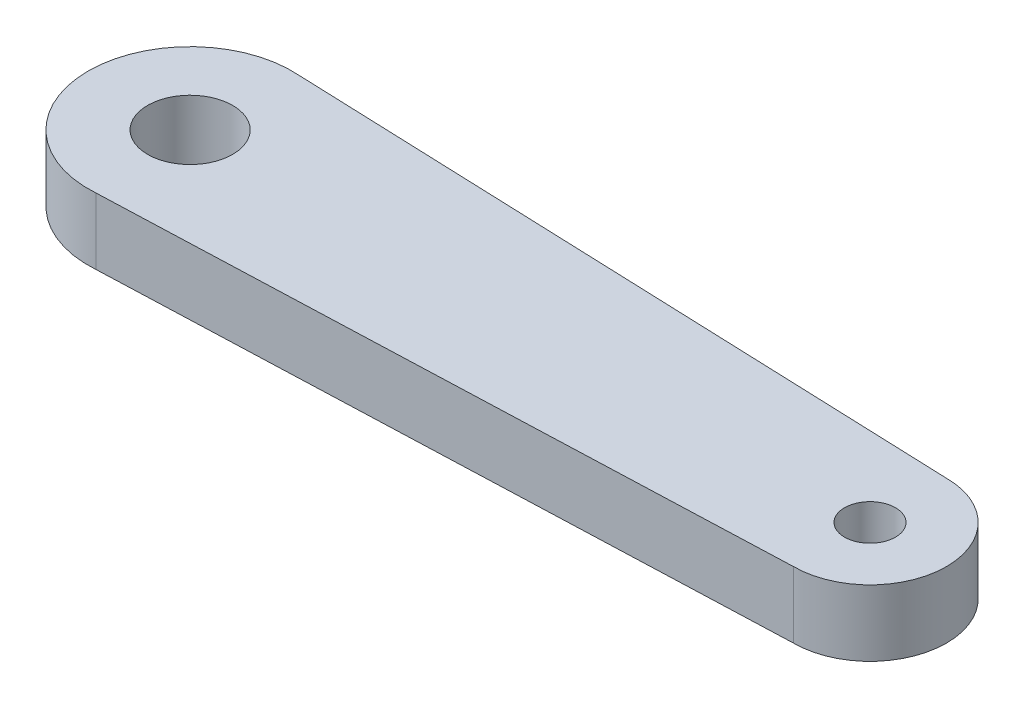
ISO-10303-21;
HEADER;
FILE_DESCRIPTION(('STEP AP214'),'2;1');
FILE_NAME('part.step','',(''),(''),'','','');
FILE_SCHEMA(('AUTOMOTIVE_DESIGN { 1 0 10303 214 1 1 1 1 }'));
ENDSEC;
DATA;
#1=APPLICATION_CONTEXT('core data for automotive mechanical design processes');
#2=APPLICATION_PROTOCOL_DEFINITION('international standard','automotive_design',2000,#1);
#3=PRODUCT_CONTEXT('',#1,'mechanical');
#4=PRODUCT('Part','Part','',(#3));
#5=PRODUCT_RELATED_PRODUCT_CATEGORY('part','',(#4));
#6=PRODUCT_DEFINITION_FORMATION('','',#4);
#7=PRODUCT_DEFINITION_CONTEXT('part definition',#1,'design');
#8=PRODUCT_DEFINITION('design','',#6,#7);
#9=PRODUCT_DEFINITION_SHAPE('','',#8);
#10=(LENGTH_UNIT() NAMED_UNIT(*) SI_UNIT(.MILLI.,.METRE.));
#11=(NAMED_UNIT(*) PLANE_ANGLE_UNIT() SI_UNIT($,.RADIAN.));
#12=(NAMED_UNIT(*) SI_UNIT($,.STERADIAN.) SOLID_ANGLE_UNIT());
#13=UNCERTAINTY_MEASURE_WITH_UNIT(LENGTH_MEASURE(1.E-05),#10,'distance_accuracy_value','');
#14=(GEOMETRIC_REPRESENTATION_CONTEXT(3) GLOBAL_UNCERTAINTY_ASSIGNED_CONTEXT((#13)) GLOBAL_UNIT_ASSIGNED_CONTEXT((#10,
#11,#12)) REPRESENTATION_CONTEXT('',''));
#15=CARTESIAN_POINT('',(0.,0.,0.));
#16=DIRECTION('',(0.,0.,1.));
#17=DIRECTION('',(1.,0.,0.));
#18=AXIS2_PLACEMENT_3D('',#15,#16,#17);
#19=CARTESIAN_POINT('',(0.,3.9,0.));
#20=DIRECTION('',(0.,-1.,0.));
#21=DIRECTION('',(0.,0.,-1.));
#22=AXIS2_PLACEMENT_3D('',#19,#20,#21);
#23=CYLINDRICAL_SURFACE('',#22,6.);
#24=CARTESIAN_POINT('',(0.,0.,0.));
#25=DIRECTION('',(0.,1.,0.));
#26=DIRECTION('',(0.,0.,1.));
#27=AXIS2_PLACEMENT_3D('',#24,#25,#26);
#28=CIRCLE('',#27,6.);
#29=CARTESIAN_POINT('',(0.449368076142934,0.,-5.98314869714464));
#30=VERTEX_POINT('',#29);
#31=CARTESIAN_POINT('',(0.449368076142934,0.,5.98314869714464));
#32=VERTEX_POINT('',#31);
#33=EDGE_CURVE('E110',#30,#32,#28,.T.);
#34=ORIENTED_EDGE('',*,*,#33,.T.);
#35=DIRECTION('',(0.,-1.,0.));
#36=VECTOR('',#35,1.);
#37=CARTESIAN_POINT('',(0.449368076142934,3.9,5.98314869714464));
#38=LINE('',#37,#36);
#39=CARTESIAN_POINT('',(0.449368076142934,3.9,5.98314869714464));
#40=VERTEX_POINT('',#39);
#41=EDGE_CURVE('E11',#40,#32,#38,.T.);
#42=ORIENTED_EDGE('',*,*,#41,.F.);
#43=CARTESIAN_POINT('',(0.,3.9,0.));
#44=DIRECTION('',(0.,1.,0.));
#45=DIRECTION('',(0.,0.,1.));
#46=AXIS2_PLACEMENT_3D('',#43,#44,#45);
#47=CIRCLE('',#46,6.);
#48=CARTESIAN_POINT('',(0.449368076142934,3.9,-5.98314869714464));
#49=VERTEX_POINT('',#48);
#50=EDGE_CURVE('E91',#49,#40,#47,.T.);
#51=ORIENTED_EDGE('',*,*,#50,.F.);
#52=DIRECTION('',(0.,-1.,0.));
#53=VECTOR('',#52,1.);
#54=CARTESIAN_POINT('',(0.449368076142934,3.9,-5.98314869714464));
#55=LINE('',#54,#53);
#56=EDGE_CURVE('E58',#49,#30,#55,.T.);
#57=ORIENTED_EDGE('',*,*,#56,.T.);
#58=EDGE_LOOP('',(#34,#42,#51,#57));
#59=FACE_BOUND('',#58,.T.);
#60=ADVANCED_FACE('F39',(#59),#23,.T.);
#61=CARTESIAN_POINT('',(0.449368076142934,3.9,5.98314869714464));
#62=DIRECTION('',(-0.0374736605890943,0.,-0.999297615709181));
#63=DIRECTION('',(-0.999297615709181,0.,0.0374736605890943));
#64=AXIS2_PLACEMENT_3D('',#61,#62,#63);
#65=PLANE('',#64);
#66=DIRECTION('',(0.999297615709181,0.,-0.0374736605890943));
#67=VECTOR('',#66,1.);
#68=CARTESIAN_POINT('',(0.449368076142934,0.,5.98314869714464));
#69=LINE('',#68,#67);
#70=CARTESIAN_POINT('',(40.,0.,4.5));
#71=VERTEX_POINT('',#70);
#72=EDGE_CURVE('E97',#32,#71,#69,.T.);
#73=ORIENTED_EDGE('',*,*,#72,.T.);
#74=DIRECTION('',(0.,-1.,0.));
#75=VECTOR('',#74,1.);
#76=CARTESIAN_POINT('',(40.,3.9,4.5));
#77=LINE('',#76,#75);
#78=CARTESIAN_POINT('',(40.,3.9,4.5));
#79=VERTEX_POINT('',#78);
#80=EDGE_CURVE('E49',#79,#71,#77,.T.);
#81=ORIENTED_EDGE('',*,*,#80,.F.);
#82=DIRECTION('',(0.999297615709181,0.,-0.0374736605890943));
#83=VECTOR('',#82,1.);
#84=CARTESIAN_POINT('',(0.449368076142934,3.9,5.98314869714464));
#85=LINE('',#84,#83);
#86=EDGE_CURVE('E84',#40,#79,#85,.T.);
#87=ORIENTED_EDGE('',*,*,#86,.F.);
#88=ORIENTED_EDGE('',*,*,#41,.T.);
#89=EDGE_LOOP('',(#73,#81,#87,#88));
#90=FACE_BOUND('',#89,.T.);
#91=ADVANCED_FACE('F96',(#90),#65,.F.);
#92=CARTESIAN_POINT('',(40.,3.9,0.));
#93=DIRECTION('',(0.,-1.,0.));
#94=DIRECTION('',(0.,0.,-1.));
#95=AXIS2_PLACEMENT_3D('',#92,#93,#94);
#96=CYLINDRICAL_SURFACE('',#95,4.5);
#97=CARTESIAN_POINT('',(40.,0.,0.));
#98=DIRECTION('',(0.,1.,0.));
#99=DIRECTION('',(0.,0.,1.));
#100=AXIS2_PLACEMENT_3D('',#97,#98,#99);
#101=CIRCLE('',#100,4.5);
#102=CARTESIAN_POINT('',(40.,0.,-4.5));
#103=VERTEX_POINT('',#102);
#104=EDGE_CURVE('E116',#71,#103,#101,.T.);
#105=ORIENTED_EDGE('',*,*,#104,.T.);
#106=DIRECTION('',(0.,-1.,0.));
#107=VECTOR('',#106,1.);
#108=CARTESIAN_POINT('',(40.,3.9,-4.5));
#109=LINE('',#108,#107);
#110=CARTESIAN_POINT('',(40.,3.9,-4.5));
#111=VERTEX_POINT('',#110);
#112=EDGE_CURVE('E73',#111,#103,#109,.T.);
#113=ORIENTED_EDGE('',*,*,#112,.F.);
#114=CARTESIAN_POINT('',(40.,3.9,0.));
#115=DIRECTION('',(0.,1.,0.));
#116=DIRECTION('',(0.,0.,1.));
#117=AXIS2_PLACEMENT_3D('',#114,#115,#116);
#118=CIRCLE('',#117,4.5);
#119=EDGE_CURVE('E90',#79,#111,#118,.T.);
#120=ORIENTED_EDGE('',*,*,#119,.F.);
#121=ORIENTED_EDGE('',*,*,#80,.T.);
#122=EDGE_LOOP('',(#105,#113,#120,#121));
#123=FACE_BOUND('',#122,.T.);
#124=ADVANCED_FACE('F102',(#123),#96,.T.);
#125=CARTESIAN_POINT('',(0.449368076142934,3.9,-5.98314869714464));
#126=DIRECTION('',(0.0374736605890943,0.,-0.999297615709181));
#127=DIRECTION('',(-0.999297615709181,0.,-0.0374736605890943));
#128=AXIS2_PLACEMENT_3D('',#125,#126,#127);
#129=PLANE('',#128);
#130=DIRECTION('',(0.999297615709181,0.,0.0374736605890943));
#131=VECTOR('',#130,1.);
#132=CARTESIAN_POINT('',(0.449368076142934,0.,-5.98314869714464));
#133=LINE('',#132,#131);
#134=EDGE_CURVE('E119',#30,#103,#133,.T.);
#135=ORIENTED_EDGE('',*,*,#134,.F.);
#136=ORIENTED_EDGE('',*,*,#56,.F.);
#137=DIRECTION('',(0.999297615709181,0.,0.0374736605890943));
#138=VECTOR('',#137,1.);
#139=CARTESIAN_POINT('',(0.449368076142934,3.9,-5.98314869714464));
#140=LINE('',#139,#138);
#141=EDGE_CURVE('E104',#49,#111,#140,.T.);
#142=ORIENTED_EDGE('',*,*,#141,.T.);
#143=ORIENTED_EDGE('',*,*,#112,.T.);
#144=EDGE_LOOP('',(#135,#136,#142,#143));
#145=FACE_BOUND('',#144,.T.);
#146=ADVANCED_FACE('F158',(#145),#129,.T.);
#147=CARTESIAN_POINT('',(0.,3.9,0.));
#148=DIRECTION('',(0.,1.,0.));
#149=DIRECTION('',(0.,0.,1.));
#150=AXIS2_PLACEMENT_3D('',#147,#148,#149);
#151=PLANE('',#150);
#152=CARTESIAN_POINT('',(0.,3.9,0.));
#153=DIRECTION('',(0.,1.,0.));
#154=DIRECTION('',(0.,0.,1.));
#155=AXIS2_PLACEMENT_3D('',#152,#153,#154);
#156=CIRCLE('',#155,2.5);
#157=CARTESIAN_POINT('',(0.,3.9,2.5));
#158=VERTEX_POINT('',#157);
#159=EDGE_CURVE('E113',#158,#158,#156,.F.);
#160=ORIENTED_EDGE('',*,*,#159,.T.);
#161=EDGE_LOOP('',(#160));
#162=FACE_BOUND('',#161,.T.);
#163=CARTESIAN_POINT('',(40.,3.9,0.));
#164=DIRECTION('',(0.,1.,0.));
#165=DIRECTION('',(0.,0.,1.));
#166=AXIS2_PLACEMENT_3D('',#163,#164,#165);
#167=CIRCLE('',#166,1.5);
#168=CARTESIAN_POINT('',(40.,3.9,1.5));
#169=VERTEX_POINT('',#168);
#170=EDGE_CURVE('E129',#169,#169,#167,.F.);
#171=ORIENTED_EDGE('',*,*,#170,.T.);
#172=EDGE_LOOP('',(#171));
#173=FACE_BOUND('',#172,.T.);
#174=ORIENTED_EDGE('',*,*,#50,.T.);
#175=ORIENTED_EDGE('',*,*,#86,.T.);
#176=ORIENTED_EDGE('',*,*,#119,.T.);
#177=ORIENTED_EDGE('',*,*,#141,.F.);
#178=EDGE_LOOP('',(#174,#175,#176,#177));
#179=FACE_BOUND('',#178,.T.);
#180=ADVANCED_FACE('F87',(#162,#173,#179),#151,.T.);
#181=CARTESIAN_POINT('',(0.,0.,0.));
#182=DIRECTION('',(0.,1.,0.));
#183=DIRECTION('',(0.,0.,1.));
#184=AXIS2_PLACEMENT_3D('',#181,#182,#183);
#185=PLANE('',#184);
#186=CARTESIAN_POINT('',(0.,0.,0.));
#187=DIRECTION('',(0.,1.,0.));
#188=DIRECTION('',(0.,0.,1.));
#189=AXIS2_PLACEMENT_3D('',#186,#187,#188);
#190=CIRCLE('',#189,2.5);
#191=CARTESIAN_POINT('',(0.,0.,2.5));
#192=VERTEX_POINT('',#191);
#193=EDGE_CURVE('E42',#192,#192,#190,.F.);
#194=ORIENTED_EDGE('',*,*,#193,.F.);
#195=EDGE_LOOP('',(#194));
#196=FACE_BOUND('',#195,.T.);
#197=CARTESIAN_POINT('',(40.,0.,0.));
#198=DIRECTION('',(0.,1.,0.));
#199=DIRECTION('',(0.,0.,1.));
#200=AXIS2_PLACEMENT_3D('',#197,#198,#199);
#201=CIRCLE('',#200,1.5);
#202=CARTESIAN_POINT('',(40.,0.,1.5));
#203=VERTEX_POINT('',#202);
#204=EDGE_CURVE('E126',#203,#203,#201,.F.);
#205=ORIENTED_EDGE('',*,*,#204,.F.);
#206=EDGE_LOOP('',(#205));
#207=FACE_BOUND('',#206,.T.);
#208=ORIENTED_EDGE('',*,*,#33,.F.);
#209=ORIENTED_EDGE('',*,*,#134,.T.);
#210=ORIENTED_EDGE('',*,*,#104,.F.);
#211=ORIENTED_EDGE('',*,*,#72,.F.);
#212=EDGE_LOOP('',(#208,#209,#210,#211));
#213=FACE_BOUND('',#212,.T.);
#214=ADVANCED_FACE('F153',(#196,#207,#213),#185,.F.);
#215=CARTESIAN_POINT('',(40.,19.9,0.));
#216=DIRECTION('',(0.,-1.,0.));
#217=DIRECTION('',(0.,0.,-1.));
#218=AXIS2_PLACEMENT_3D('',#215,#216,#217);
#219=CYLINDRICAL_SURFACE('',#218,1.5);
#220=ORIENTED_EDGE('',*,*,#170,.F.);
#221=EDGE_LOOP('',(#220));
#222=FACE_BOUND('',#221,.T.);
#223=ORIENTED_EDGE('',*,*,#204,.T.);
#224=EDGE_LOOP('',(#223));
#225=FACE_BOUND('',#224,.T.);
#226=ADVANCED_FACE('F149',(#222,#225),#219,.F.);
#227=CARTESIAN_POINT('',(0.,19.9,0.));
#228=DIRECTION('',(0.,-1.,0.));
#229=DIRECTION('',(0.,0.,-1.));
#230=AXIS2_PLACEMENT_3D('',#227,#228,#229);
#231=CYLINDRICAL_SURFACE('',#230,2.5);
#232=ORIENTED_EDGE('',*,*,#159,.F.);
#233=EDGE_LOOP('',(#232));
#234=FACE_BOUND('',#233,.T.);
#235=ORIENTED_EDGE('',*,*,#193,.T.);
#236=EDGE_LOOP('',(#235));
#237=FACE_BOUND('',#236,.T.);
#238=ADVANCED_FACE('F146',(#234,#237),#231,.F.);
#239=CLOSED_SHELL('',(#60,#91,#124,#146,#180,#214,#226,#238));
#240=MANIFOLD_SOLID_BREP('B2',#239);
#241=ADVANCED_BREP_SHAPE_REPRESENTATION('',(#18,#240),#14);
#242=SHAPE_DEFINITION_REPRESENTATION(#9,#241);
ENDSEC;
END-ISO-10303-21;
